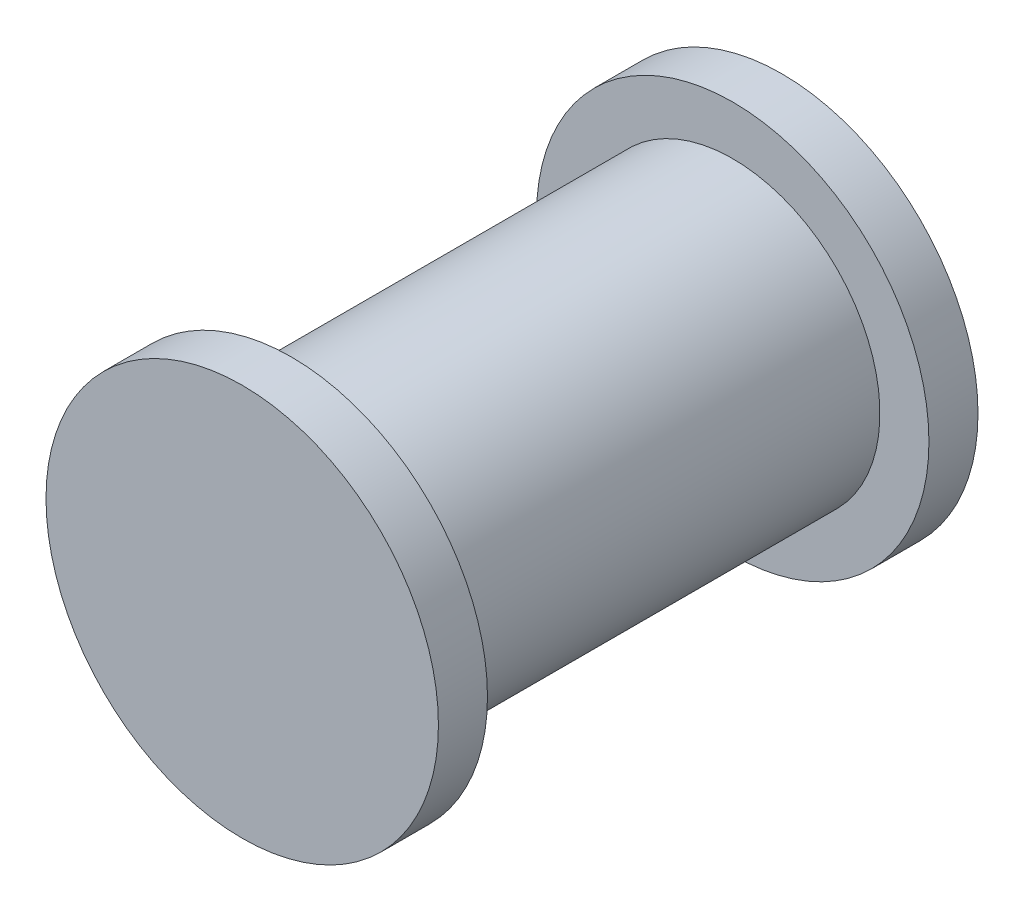
ISO-10303-21;
HEADER;
FILE_DESCRIPTION(('STEP AP214'),'2;1');
FILE_NAME('part.step','',(''),(''),'','','');
FILE_SCHEMA(('AUTOMOTIVE_DESIGN { 1 0 10303 214 1 1 1 1 }'));
ENDSEC;
DATA;
#1=APPLICATION_CONTEXT('core data for automotive mechanical design processes');
#2=APPLICATION_PROTOCOL_DEFINITION('international standard','automotive_design',2000,#1);
#3=PRODUCT_CONTEXT('',#1,'mechanical');
#4=PRODUCT('Part','Part','',(#3));
#5=PRODUCT_RELATED_PRODUCT_CATEGORY('part','',(#4));
#6=PRODUCT_DEFINITION_FORMATION('','',#4);
#7=PRODUCT_DEFINITION_CONTEXT('part definition',#1,'design');
#8=PRODUCT_DEFINITION('design','',#6,#7);
#9=PRODUCT_DEFINITION_SHAPE('','',#8);
#10=(LENGTH_UNIT() NAMED_UNIT(*) SI_UNIT(.MILLI.,.METRE.));
#11=(NAMED_UNIT(*) PLANE_ANGLE_UNIT() SI_UNIT($,.RADIAN.));
#12=(NAMED_UNIT(*) SI_UNIT($,.STERADIAN.) SOLID_ANGLE_UNIT());
#13=UNCERTAINTY_MEASURE_WITH_UNIT(LENGTH_MEASURE(1.E-05),#10,'distance_accuracy_value','');
#14=(GEOMETRIC_REPRESENTATION_CONTEXT(3) GLOBAL_UNCERTAINTY_ASSIGNED_CONTEXT((#13)) GLOBAL_UNIT_ASSIGNED_CONTEXT((#10,
#11,#12)) REPRESENTATION_CONTEXT('',''));
#15=CARTESIAN_POINT('',(0.,0.,0.));
#16=DIRECTION('',(0.,0.,1.));
#17=DIRECTION('',(1.,0.,0.));
#18=AXIS2_PLACEMENT_3D('',#15,#16,#17);
#19=CARTESIAN_POINT('',(0.,0.,31.05));
#20=DIRECTION('',(0.,0.,-1.));
#21=DIRECTION('',(-1.,0.,0.));
#22=AXIS2_PLACEMENT_3D('',#19,#20,#21);
#23=CYLINDRICAL_SURFACE('',#22,10.35);
#24=CARTESIAN_POINT('',(0.,0.,31.05));
#25=DIRECTION('',(0.,0.,1.));
#26=DIRECTION('',(1.,0.,0.));
#27=AXIS2_PLACEMENT_3D('',#24,#25,#26);
#28=CIRCLE('',#27,10.35);
#29=CARTESIAN_POINT('',(-10.35,0.,31.05));
#30=VERTEX_POINT('',#29);
#31=EDGE_CURVE('E10',#30,#30,#28,.T.);
#32=CARTESIAN_POINT('',(0.,0.,0.));
#33=DIRECTION('',(0.,0.,-1.));
#34=DIRECTION('',(-1.,0.,0.));
#35=AXIS2_PLACEMENT_3D('',#32,#33,#34);
#36=CIRCLE('',#35,10.35);
#37=CARTESIAN_POINT('',(-10.35,0.,0.));
#38=VERTEX_POINT('',#37);
#39=EDGE_CURVE('E46',#38,#38,#36,.T.);
#40=CARTESIAN_POINT('',(-10.35,0.,31.05));
#41=CARTESIAN_POINT('',(-10.35,0.,30.7265625));
#42=CARTESIAN_POINT('',(-10.35,0.,30.403125));
#43=CARTESIAN_POINT('',(-10.35,0.,29.75625));
#44=CARTESIAN_POINT('',(-10.35,0.,29.4328125));
#45=CARTESIAN_POINT('',(-10.35,0.,28.7859375));
#46=CARTESIAN_POINT('',(-10.35,0.,28.4625));
#47=CARTESIAN_POINT('',(-10.35,0.,27.815625));
#48=CARTESIAN_POINT('',(-10.35,0.,27.4921875));
#49=CARTESIAN_POINT('',(-10.35,0.,26.8453125));
#50=CARTESIAN_POINT('',(-10.35,0.,26.521875));
#51=CARTESIAN_POINT('',(-10.35,0.,25.875));
#52=CARTESIAN_POINT('',(-10.35,0.,25.5515625));
#53=CARTESIAN_POINT('',(-10.35,0.,24.9046875));
#54=CARTESIAN_POINT('',(-10.35,0.,24.58125));
#55=CARTESIAN_POINT('',(-10.35,0.,23.934375));
#56=CARTESIAN_POINT('',(-10.35,0.,23.6109375));
#57=CARTESIAN_POINT('',(-10.35,0.,22.9640625));
#58=CARTESIAN_POINT('',(-10.35,0.,22.640625));
#59=CARTESIAN_POINT('',(-10.35,0.,21.99375));
#60=CARTESIAN_POINT('',(-10.35,0.,21.6703125));
#61=CARTESIAN_POINT('',(-10.35,0.,21.0234375));
#62=CARTESIAN_POINT('',(-10.35,0.,20.7));
#63=CARTESIAN_POINT('',(-10.35,0.,20.053125));
#64=CARTESIAN_POINT('',(-10.35,0.,19.7296875));
#65=CARTESIAN_POINT('',(-10.35,0.,19.0828125));
#66=CARTESIAN_POINT('',(-10.35,0.,18.759375));
#67=CARTESIAN_POINT('',(-10.35,0.,18.1125));
#68=CARTESIAN_POINT('',(-10.35,0.,17.7890625));
#69=CARTESIAN_POINT('',(-10.35,0.,17.1421875));
#70=CARTESIAN_POINT('',(-10.35,0.,16.81875));
#71=CARTESIAN_POINT('',(-10.35,0.,16.171875));
#72=CARTESIAN_POINT('',(-10.35,0.,15.8484375));
#73=CARTESIAN_POINT('',(-10.35,0.,15.2015625));
#74=CARTESIAN_POINT('',(-10.35,0.,14.878125));
#75=CARTESIAN_POINT('',(-10.35,0.,14.23125));
#76=CARTESIAN_POINT('',(-10.35,0.,13.9078125));
#77=CARTESIAN_POINT('',(-10.35,0.,13.2609375));
#78=CARTESIAN_POINT('',(-10.35,0.,12.9375));
#79=CARTESIAN_POINT('',(-10.35,0.,12.290625));
#80=CARTESIAN_POINT('',(-10.35,0.,11.9671875));
#81=CARTESIAN_POINT('',(-10.35,0.,11.3203125));
#82=CARTESIAN_POINT('',(-10.35,0.,10.996875));
#83=CARTESIAN_POINT('',(-10.35,0.,10.35));
#84=CARTESIAN_POINT('',(-10.35,0.,10.0265625));
#85=CARTESIAN_POINT('',(-10.35,0.,9.3796875));
#86=CARTESIAN_POINT('',(-10.35,0.,9.05625));
#87=CARTESIAN_POINT('',(-10.35,0.,8.409375));
#88=CARTESIAN_POINT('',(-10.35,0.,8.0859375));
#89=CARTESIAN_POINT('',(-10.35,0.,7.4390625));
#90=CARTESIAN_POINT('',(-10.35,0.,7.115625));
#91=CARTESIAN_POINT('',(-10.35,0.,6.46875));
#92=CARTESIAN_POINT('',(-10.35,0.,6.1453125));
#93=CARTESIAN_POINT('',(-10.35,0.,5.4984375));
#94=CARTESIAN_POINT('',(-10.35,0.,5.175));
#95=CARTESIAN_POINT('',(-10.35,0.,4.528125));
#96=CARTESIAN_POINT('',(-10.35,0.,4.2046875));
#97=CARTESIAN_POINT('',(-10.35,0.,3.5578125));
#98=CARTESIAN_POINT('',(-10.35,0.,3.234375));
#99=CARTESIAN_POINT('',(-10.35,0.,2.5875));
#100=CARTESIAN_POINT('',(-10.35,0.,2.2640625));
#101=CARTESIAN_POINT('',(-10.35,0.,1.6171875));
#102=CARTESIAN_POINT('',(-10.35,0.,1.29375));
#103=CARTESIAN_POINT('',(-10.35,0.,0.646875000000001));
#104=CARTESIAN_POINT('',(-10.35,0.,0.3234375));
#105=CARTESIAN_POINT('',(-10.35,0.,0.));
#106=B_SPLINE_CURVE_WITH_KNOTS('',3,(#40,#41,#42,#43,#44,#45,#46,#47,#48,#49,#50,#51,#52,#53,
#54,#55,#56,#57,#58,#59,#60,#61,#62,#63,#64,#65,#66,#67,#68,#69,#70,#71,#72,#73,#74,#75,#76,#77,
#78,#79,#80,#81,#82,#83,#84,#85,#86,#87,#88,#89,#90,#91,#92,#93,#94,#95,#96,#97,#98,#99,#100,
#101,#102,#103,#104,#105),.UNSPECIFIED.,.F.,.F.,(4,2,2,2,2,2,2,2,2,2,2,2,2,2,2,2,2,2,2,2,2,2,2,
2,2,2,2,2,2,2,2,2,4),(0.,0.970312500000001,1.940625,2.9109375,3.88125,4.8515625,5.821875,
6.7921875,7.7625,8.7328125,9.703125,10.6734375,11.64375,12.6140625,13.584375,14.5546875,15.525,
16.4953125,17.465625,18.4359375,19.40625,20.3765625,21.346875,22.3171875,23.2875,24.2578125,
25.228125,26.1984375,27.16875,28.1390625,29.109375,30.0796875,31.05),.UNSPECIFIED.);
#107=EDGE_CURVE('BSEAM31',#30,#38,#106,.T.);
#108=ORIENTED_EDGE('',*,*,#31,.F.);
#109=ORIENTED_EDGE('',*,*,#39,.F.);
#110=ORIENTED_EDGE('',*,*,#107,.T.);
#111=ORIENTED_EDGE('',*,*,#107,.F.);
#112=EDGE_LOOP('',(#108,#110,#109,#111));
#113=FACE_BOUND('',#112,.T.);
#114=ADVANCED_FACE('F31',(#113),#23,.T.);
#115=CARTESIAN_POINT('',(0.,0.,31.05));
#116=DIRECTION('',(0.,0.,1.));
#117=DIRECTION('',(1.,0.,0.));
#118=AXIS2_PLACEMENT_3D('',#115,#116,#117);
#119=PLANE('',#118);
#120=CARTESIAN_POINT('',(0.,0.,31.05));
#121=DIRECTION('',(0.,0.,1.));
#122=DIRECTION('',(1.,0.,0.));
#123=AXIS2_PLACEMENT_3D('',#120,#121,#122);
#124=CIRCLE('',#123,13.8);
#125=CARTESIAN_POINT('',(13.8,0.,31.05));
#126=VERTEX_POINT('',#125);
#127=EDGE_CURVE('E41',#126,#126,#124,.T.);
#128=ORIENTED_EDGE('',*,*,#127,.F.);
#129=EDGE_LOOP('',(#128));
#130=FACE_BOUND('',#129,.T.);
#131=ORIENTED_EDGE('',*,*,#31,.T.);
#132=EDGE_LOOP('',(#131));
#133=FACE_BOUND('',#132,.T.);
#134=ADVANCED_FACE('F73',(#130,#133),#119,.F.);
#135=CARTESIAN_POINT('',(0.,0.,34.5));
#136=DIRECTION('',(0.,0.,-1.));
#137=DIRECTION('',(-1.,0.,0.));
#138=AXIS2_PLACEMENT_3D('',#135,#136,#137);
#139=CYLINDRICAL_SURFACE('',#138,13.8);
#140=CARTESIAN_POINT('',(0.,0.,34.5));
#141=DIRECTION('',(0.,0.,1.));
#142=DIRECTION('',(1.,0.,0.));
#143=AXIS2_PLACEMENT_3D('',#140,#141,#142);
#144=CIRCLE('',#143,13.8);
#145=CARTESIAN_POINT('',(13.8,0.,34.5));
#146=VERTEX_POINT('',#145);
#147=EDGE_CURVE('E37',#146,#146,#144,.T.);
#148=ORIENTED_EDGE('',*,*,#147,.F.);
#149=EDGE_LOOP('',(#148));
#150=FACE_BOUND('',#149,.T.);
#151=ORIENTED_EDGE('',*,*,#127,.T.);
#152=EDGE_LOOP('',(#151));
#153=FACE_BOUND('',#152,.T.);
#154=ADVANCED_FACE('F78',(#150,#153),#139,.T.);
#155=CARTESIAN_POINT('',(0.,0.,34.5));
#156=DIRECTION('',(0.,0.,1.));
#157=DIRECTION('',(1.,0.,0.));
#158=AXIS2_PLACEMENT_3D('',#155,#156,#157);
#159=PLANE('',#158);
#160=ORIENTED_EDGE('',*,*,#147,.T.);
#161=EDGE_LOOP('',(#160));
#162=FACE_BOUND('',#161,.T.);
#163=ADVANCED_FACE('F68',(#162),#159,.T.);
#164=CARTESIAN_POINT('',(0.,0.,0.));
#165=DIRECTION('',(0.,0.,-1.));
#166=DIRECTION('',(-1.,0.,0.));
#167=AXIS2_PLACEMENT_3D('',#164,#165,#166);
#168=PLANE('',#167);
#169=CARTESIAN_POINT('',(0.,0.,0.));
#170=DIRECTION('',(0.,0.,-1.));
#171=DIRECTION('',(-1.,0.,0.));
#172=AXIS2_PLACEMENT_3D('',#169,#170,#171);
#173=CIRCLE('',#172,13.8);
#174=CARTESIAN_POINT('',(-13.8,0.,0.));
#175=VERTEX_POINT('',#174);
#176=EDGE_CURVE('E51',#175,#175,#173,.T.);
#177=ORIENTED_EDGE('',*,*,#176,.F.);
#178=EDGE_LOOP('',(#177));
#179=FACE_BOUND('',#178,.T.);
#180=ORIENTED_EDGE('',*,*,#39,.T.);
#181=EDGE_LOOP('',(#180));
#182=FACE_BOUND('',#181,.T.);
#183=ADVANCED_FACE('F62',(#179,#182),#168,.F.);
#184=CARTESIAN_POINT('',(0.,0.,-3.45));
#185=DIRECTION('',(0.,0.,1.));
#186=DIRECTION('',(1.,0.,0.));
#187=AXIS2_PLACEMENT_3D('',#184,#185,#186);
#188=CYLINDRICAL_SURFACE('',#187,13.8);
#189=CARTESIAN_POINT('',(0.,0.,-3.45));
#190=DIRECTION('',(0.,0.,-1.));
#191=DIRECTION('',(-1.,0.,0.));
#192=AXIS2_PLACEMENT_3D('',#189,#190,#191);
#193=CIRCLE('',#192,13.8);
#194=CARTESIAN_POINT('',(-13.8,0.,-3.45));
#195=VERTEX_POINT('',#194);
#196=EDGE_CURVE('E50',#195,#195,#193,.T.);
#197=ORIENTED_EDGE('',*,*,#196,.F.);
#198=EDGE_LOOP('',(#197));
#199=FACE_BOUND('',#198,.T.);
#200=ORIENTED_EDGE('',*,*,#176,.T.);
#201=EDGE_LOOP('',(#200));
#202=FACE_BOUND('',#201,.T.);
#203=ADVANCED_FACE('F59',(#199,#202),#188,.T.);
#204=CARTESIAN_POINT('',(0.,0.,-3.45));
#205=DIRECTION('',(0.,0.,-1.));
#206=DIRECTION('',(-1.,0.,0.));
#207=AXIS2_PLACEMENT_3D('',#204,#205,#206);
#208=PLANE('',#207);
#209=ORIENTED_EDGE('',*,*,#196,.T.);
#210=EDGE_LOOP('',(#209));
#211=FACE_BOUND('',#210,.T.);
#212=ADVANCED_FACE('F57',(#211),#208,.T.);
#213=CLOSED_SHELL('',(#114,#134,#154,#163,#183,#203,#212));
#214=MANIFOLD_SOLID_BREP('B2',#213);
#215=ADVANCED_BREP_SHAPE_REPRESENTATION('',(#18,#214),#14);
#216=SHAPE_DEFINITION_REPRESENTATION(#9,#215);
ENDSEC;
END-ISO-10303-21;
